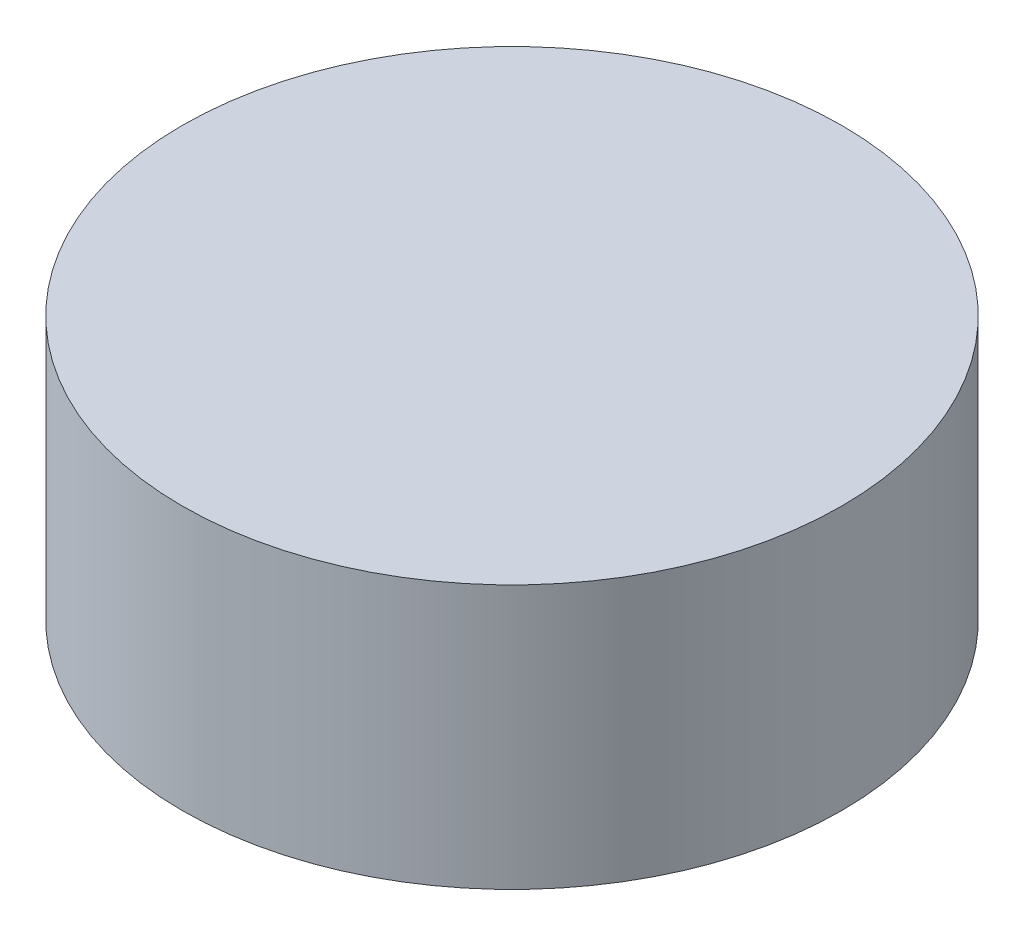
ISO-10303-21;
HEADER;
FILE_DESCRIPTION(('STEP AP214'),'2;1');
FILE_NAME('part.step','',(''),(''),'','','');
FILE_SCHEMA(('AUTOMOTIVE_DESIGN { 1 0 10303 214 1 1 1 1 }'));
ENDSEC;
DATA;
#1=APPLICATION_CONTEXT('core data for automotive mechanical design processes');
#2=APPLICATION_PROTOCOL_DEFINITION('international standard','automotive_design',2000,#1);
#3=PRODUCT_CONTEXT('',#1,'mechanical');
#4=PRODUCT('Part','Part','',(#3));
#5=PRODUCT_RELATED_PRODUCT_CATEGORY('part','',(#4));
#6=PRODUCT_DEFINITION_FORMATION('','',#4);
#7=PRODUCT_DEFINITION_CONTEXT('part definition',#1,'design');
#8=PRODUCT_DEFINITION('design','',#6,#7);
#9=PRODUCT_DEFINITION_SHAPE('','',#8);
#10=(LENGTH_UNIT() NAMED_UNIT(*) SI_UNIT(.MILLI.,.METRE.));
#11=(NAMED_UNIT(*) PLANE_ANGLE_UNIT() SI_UNIT($,.RADIAN.));
#12=(NAMED_UNIT(*) SI_UNIT($,.STERADIAN.) SOLID_ANGLE_UNIT());
#13=UNCERTAINTY_MEASURE_WITH_UNIT(LENGTH_MEASURE(1.E-05),#10,'distance_accuracy_value','');
#14=(GEOMETRIC_REPRESENTATION_CONTEXT(3) GLOBAL_UNCERTAINTY_ASSIGNED_CONTEXT((#13)) GLOBAL_UNIT_ASSIGNED_CONTEXT((#10,
#11,#12)) REPRESENTATION_CONTEXT('',''));
#15=CARTESIAN_POINT('',(0.,0.,0.));
#16=DIRECTION('',(0.,0.,1.));
#17=DIRECTION('',(1.,0.,0.));
#18=AXIS2_PLACEMENT_3D('',#15,#16,#17);
#19=CARTESIAN_POINT('',(0.,5.08,0.));
#20=DIRECTION('',(0.,-1.,0.));
#21=DIRECTION('',(0.,0.,-1.));
#22=AXIS2_PLACEMENT_3D('',#19,#20,#21);
#23=CYLINDRICAL_SURFACE('',#22,6.35);
#24=CARTESIAN_POINT('',(0.,5.08,0.));
#25=DIRECTION('',(0.,1.,0.));
#26=DIRECTION('',(0.,0.,1.));
#27=AXIS2_PLACEMENT_3D('',#24,#25,#26);
#28=CIRCLE('',#27,6.35);
#29=CARTESIAN_POINT('',(0.,5.08,6.35));
#30=VERTEX_POINT('',#29);
#31=EDGE_CURVE('E10',#30,#30,#28,.T.);
#32=ORIENTED_EDGE('',*,*,#31,.F.);
#33=EDGE_LOOP('',(#32));
#34=FACE_BOUND('',#33,.T.);
#35=CARTESIAN_POINT('',(0.,0.,0.));
#36=DIRECTION('',(0.,1.,0.));
#37=DIRECTION('',(0.,0.,1.));
#38=AXIS2_PLACEMENT_3D('',#35,#36,#37);
#39=CIRCLE('',#38,6.35);
#40=CARTESIAN_POINT('',(0.,0.,6.35));
#41=VERTEX_POINT('',#40);
#42=EDGE_CURVE('E44',#41,#41,#39,.T.);
#43=ORIENTED_EDGE('',*,*,#42,.T.);
#44=EDGE_LOOP('',(#43));
#45=FACE_BOUND('',#44,.T.);
#46=ADVANCED_FACE('F41',(#34,#45),#23,.T.);
#47=CARTESIAN_POINT('',(0.,5.08,0.));
#48=DIRECTION('',(0.,1.,0.));
#49=DIRECTION('',(0.,0.,1.));
#50=AXIS2_PLACEMENT_3D('',#47,#48,#49);
#51=PLANE('',#50);
#52=ORIENTED_EDGE('',*,*,#31,.T.);
#53=EDGE_LOOP('',(#52));
#54=FACE_BOUND('',#53,.T.);
#55=ADVANCED_FACE('F56',(#54),#51,.T.);
#56=CARTESIAN_POINT('',(0.,0.,0.));
#57=DIRECTION('',(0.,1.,0.));
#58=DIRECTION('',(0.,0.,1.));
#59=AXIS2_PLACEMENT_3D('',#56,#57,#58);
#60=PLANE('',#59);
#61=ORIENTED_EDGE('',*,*,#42,.F.);
#62=EDGE_LOOP('',(#61));
#63=FACE_BOUND('',#62,.T.);
#64=ADVANCED_FACE('F54',(#63),#60,.F.);
#65=CLOSED_SHELL('',(#46,#55,#64));
#66=MANIFOLD_SOLID_BREP('B2',#65);
#67=ADVANCED_BREP_SHAPE_REPRESENTATION('',(#18,#66),#14);
#68=SHAPE_DEFINITION_REPRESENTATION(#9,#67);
ENDSEC;
END-ISO-10303-21;
